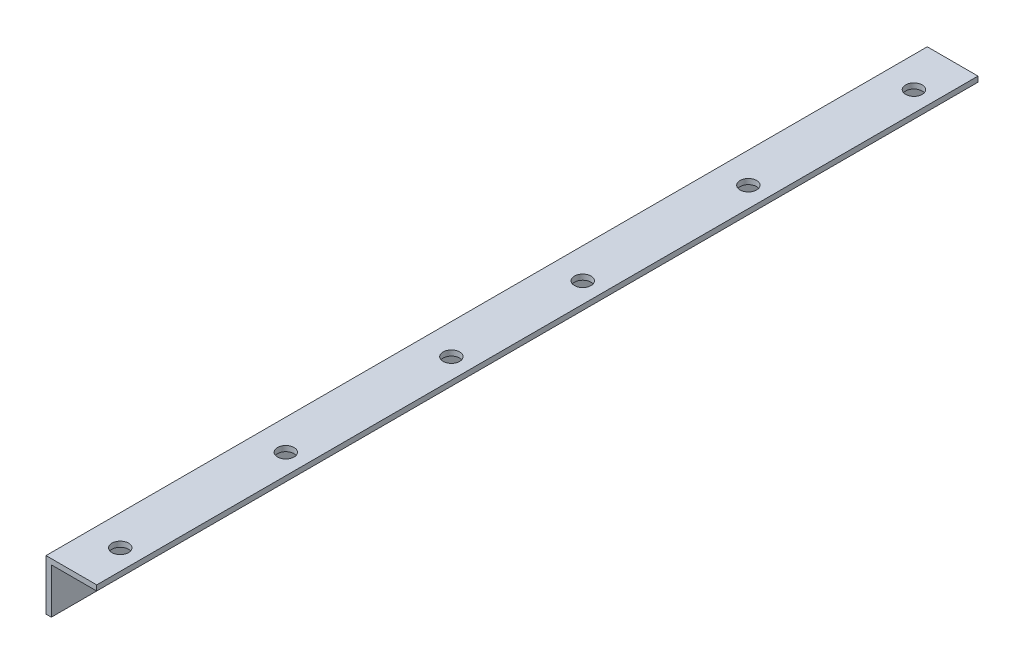
ISO-10303-21;
HEADER;
FILE_DESCRIPTION(('STEP AP214'),'2;1');
FILE_NAME('part.step','',(''),(''),'','','');
FILE_SCHEMA(('AUTOMOTIVE_DESIGN { 1 0 10303 214 1 1 1 1 }'));
ENDSEC;
DATA;
#1=APPLICATION_CONTEXT('core data for automotive mechanical design processes');
#2=APPLICATION_PROTOCOL_DEFINITION('international standard','automotive_design',2000,#1);
#3=PRODUCT_CONTEXT('',#1,'mechanical');
#4=PRODUCT('Part','Part','',(#3));
#5=PRODUCT_RELATED_PRODUCT_CATEGORY('part','',(#4));
#6=PRODUCT_DEFINITION_FORMATION('','',#4);
#7=PRODUCT_DEFINITION_CONTEXT('part definition',#1,'design');
#8=PRODUCT_DEFINITION('design','',#6,#7);
#9=PRODUCT_DEFINITION_SHAPE('','',#8);
#10=(LENGTH_UNIT() NAMED_UNIT(*) SI_UNIT(.MILLI.,.METRE.));
#11=(NAMED_UNIT(*) PLANE_ANGLE_UNIT() SI_UNIT($,.RADIAN.));
#12=(NAMED_UNIT(*) SI_UNIT($,.STERADIAN.) SOLID_ANGLE_UNIT());
#13=UNCERTAINTY_MEASURE_WITH_UNIT(LENGTH_MEASURE(1.E-05),#10,'distance_accuracy_value','');
#14=(GEOMETRIC_REPRESENTATION_CONTEXT(3) GLOBAL_UNCERTAINTY_ASSIGNED_CONTEXT((#13)) GLOBAL_UNIT_ASSIGNED_CONTEXT((#10,
#11,#12)) REPRESENTATION_CONTEXT('',''));
#15=CARTESIAN_POINT('',(0.,0.,0.));
#16=DIRECTION('',(0.,0.,1.));
#17=DIRECTION('',(1.,0.,0.));
#18=AXIS2_PLACEMENT_3D('',#15,#16,#17);
#19=CARTESIAN_POINT('',(-195.,0.,0.));
#20=DIRECTION('',(1.,0.,0.));
#21=DIRECTION('',(0.,0.,-1.));
#22=AXIS2_PLACEMENT_3D('',#19,#20,#21);
#23=PLANE('',#22);
#24=CARTESIAN_POINT('',(-195.,35.6,148.6));
#25=DIRECTION('',(1.,0.,0.));
#26=DIRECTION('',(0.,0.,-1.));
#27=AXIS2_PLACEMENT_3D('',#24,#25,#26);
#28=CIRCLE('',#27,3.175);
#29=CARTESIAN_POINT('',(-195.,35.6,145.425));
#30=VERTEX_POINT('',#29);
#31=EDGE_CURVE('E150',#30,#30,#28,.T.);
#32=ORIENTED_EDGE('',*,*,#31,.F.);
#33=EDGE_LOOP('',(#32));
#34=FACE_BOUND('',#33,.T.);
#35=CARTESIAN_POINT('',(-195.,35.6,24.6000000000001));
#36=DIRECTION('',(1.,0.,0.));
#37=DIRECTION('',(0.,0.,-1.));
#38=AXIS2_PLACEMENT_3D('',#35,#36,#37);
#39=CIRCLE('',#38,3.17499999999997);
#40=CARTESIAN_POINT('',(-195.,35.6,21.4250000000001));
#41=VERTEX_POINT('',#40);
#42=EDGE_CURVE('E138',#41,#41,#39,.T.);
#43=ORIENTED_EDGE('',*,*,#42,.F.);
#44=EDGE_LOOP('',(#43));
#45=FACE_BOUND('',#44,.T.);
#46=CARTESIAN_POINT('',(-195.,35.6,-148.6));
#47=DIRECTION('',(1.,0.,0.));
#48=DIRECTION('',(0.,0.,-1.));
#49=AXIS2_PLACEMENT_3D('',#46,#47,#48);
#50=CIRCLE('',#49,3.175);
#51=CARTESIAN_POINT('',(-195.,35.6,-151.775));
#52=VERTEX_POINT('',#51);
#53=EDGE_CURVE('E123',#52,#52,#50,.T.);
#54=ORIENTED_EDGE('',*,*,#53,.F.);
#55=EDGE_LOOP('',(#54));
#56=FACE_BOUND('',#55,.T.);
#57=CARTESIAN_POINT('',(-195.,35.6,-24.6));
#58=DIRECTION('',(1.,0.,0.));
#59=DIRECTION('',(0.,0.,-1.));
#60=AXIS2_PLACEMENT_3D('',#57,#58,#59);
#61=CIRCLE('',#60,3.17499999999996);
#62=CARTESIAN_POINT('',(-195.,35.6,-27.775));
#63=VERTEX_POINT('',#62);
#64=EDGE_CURVE('E132',#63,#63,#61,.T.);
#65=ORIENTED_EDGE('',*,*,#64,.F.);
#66=EDGE_LOOP('',(#65));
#67=FACE_BOUND('',#66,.T.);
#68=CARTESIAN_POINT('',(-195.,35.6,86.6000000000001));
#69=DIRECTION('',(1.,0.,0.));
#70=DIRECTION('',(0.,0.,-1.));
#71=AXIS2_PLACEMENT_3D('',#68,#69,#70);
#72=CIRCLE('',#71,3.17499999999997);
#73=CARTESIAN_POINT('',(-195.,35.6,83.4250000000001));
#74=VERTEX_POINT('',#73);
#75=EDGE_CURVE('E144',#74,#74,#72,.T.);
#76=ORIENTED_EDGE('',*,*,#75,.F.);
#77=EDGE_LOOP('',(#76));
#78=FACE_BOUND('',#77,.T.);
#79=CARTESIAN_POINT('',(-195.,35.6,-86.6));
#80=DIRECTION('',(1.,0.,0.));
#81=DIRECTION('',(0.,0.,-1.));
#82=AXIS2_PLACEMENT_3D('',#79,#80,#81);
#83=CIRCLE('',#82,3.17499999999997);
#84=CARTESIAN_POINT('',(-195.,35.6,-89.775));
#85=VERTEX_POINT('',#84);
#86=EDGE_CURVE('E156',#85,#85,#83,.T.);
#87=ORIENTED_EDGE('',*,*,#86,.F.);
#88=EDGE_LOOP('',(#87));
#89=FACE_BOUND('',#88,.T.);
#90=DIRECTION('',(0.,1.,0.));
#91=VECTOR('',#90,1.);
#92=CARTESIAN_POINT('',(-195.,50.,-165.));
#93=LINE('',#92,#91);
#94=CARTESIAN_POINT('',(-195.,28.,-165.));
#95=VERTEX_POINT('',#94);
#96=CARTESIAN_POINT('',(-195.,45.,-165.));
#97=VERTEX_POINT('',#96);
#98=EDGE_CURVE('E59',#95,#97,#93,.T.);
#99=ORIENTED_EDGE('',*,*,#98,.T.);
#100=DIRECTION('',(0.,0.,1.));
#101=VECTOR('',#100,1.);
#102=CARTESIAN_POINT('',(-195.,45.,0.));
#103=LINE('',#102,#101);
#104=CARTESIAN_POINT('',(-195.,45.,165.));
#105=VERTEX_POINT('',#104);
#106=EDGE_CURVE('E54',#97,#105,#103,.T.);
#107=ORIENTED_EDGE('',*,*,#106,.T.);
#108=DIRECTION('',(0.,-1.,0.));
#109=VECTOR('',#108,1.);
#110=CARTESIAN_POINT('',(-195.,50.,165.));
#111=LINE('',#110,#109);
#112=CARTESIAN_POINT('',(-195.,28.,165.));
#113=VERTEX_POINT('',#112);
#114=EDGE_CURVE('E114',#105,#113,#111,.T.);
#115=ORIENTED_EDGE('',*,*,#114,.T.);
#116=DIRECTION('',(0.,0.,-1.));
#117=VECTOR('',#116,1.);
#118=CARTESIAN_POINT('',(-195.,28.,165.));
#119=LINE('',#118,#117);
#120=EDGE_CURVE('E117',#113,#95,#119,.T.);
#121=ORIENTED_EDGE('',*,*,#120,.T.);
#122=EDGE_LOOP('',(#99,#107,#115,#121));
#123=FACE_BOUND('',#122,.T.);
#124=ADVANCED_FACE('F39',(#34,#45,#56,#67,#78,#89,#123),#23,.T.);
#125=CARTESIAN_POINT('',(-197.,0.,0.));
#126=DIRECTION('',(1.,0.,0.));
#127=DIRECTION('',(0.,0.,-1.));
#128=AXIS2_PLACEMENT_3D('',#125,#126,#127);
#129=PLANE('',#128);
#130=DIRECTION('',(0.,-1.,0.));
#131=VECTOR('',#130,1.);
#132=CARTESIAN_POINT('',(-197.,50.,165.));
#133=LINE('',#132,#131);
#134=CARTESIAN_POINT('',(-197.,46.9999999999994,165.));
#135=VERTEX_POINT('',#134);
#136=CARTESIAN_POINT('',(-197.,28.,165.));
#137=VERTEX_POINT('',#136);
#138=EDGE_CURVE('E108',#135,#137,#133,.T.);
#139=ORIENTED_EDGE('',*,*,#138,.F.);
#140=DIRECTION('',(0.,0.,-1.));
#141=VECTOR('',#140,1.);
#142=CARTESIAN_POINT('',(-197.,46.9999999999993,188.));
#143=LINE('',#142,#141);
#144=CARTESIAN_POINT('',(-197.,47.,-165.));
#145=VERTEX_POINT('',#144);
#146=EDGE_CURVE('E94',#135,#145,#143,.T.);
#147=ORIENTED_EDGE('',*,*,#146,.T.);
#148=DIRECTION('',(0.,1.,0.));
#149=VECTOR('',#148,1.);
#150=CARTESIAN_POINT('',(-197.,50.,-165.));
#151=LINE('',#150,#149);
#152=CARTESIAN_POINT('',(-197.,28.,-165.));
#153=VERTEX_POINT('',#152);
#154=EDGE_CURVE('E107',#153,#145,#151,.T.);
#155=ORIENTED_EDGE('',*,*,#154,.F.);
#156=DIRECTION('',(0.,0.,-1.));
#157=VECTOR('',#156,1.);
#158=CARTESIAN_POINT('',(-197.,28.,165.));
#159=LINE('',#158,#157);
#160=EDGE_CURVE('E115',#137,#153,#159,.T.);
#161=ORIENTED_EDGE('',*,*,#160,.F.);
#162=EDGE_LOOP('',(#139,#147,#155,#161));
#163=FACE_BOUND('',#162,.T.);
#164=CARTESIAN_POINT('',(-197.,35.6,-148.6));
#165=DIRECTION('',(1.,0.,0.));
#166=DIRECTION('',(0.,0.,-1.));
#167=AXIS2_PLACEMENT_3D('',#164,#165,#166);
#168=CIRCLE('',#167,3.175);
#169=CARTESIAN_POINT('',(-197.,35.6,-151.775));
#170=VERTEX_POINT('',#169);
#171=EDGE_CURVE('E127',#170,#170,#168,.T.);
#172=ORIENTED_EDGE('',*,*,#171,.T.);
#173=EDGE_LOOP('',(#172));
#174=FACE_BOUND('',#173,.T.);
#175=CARTESIAN_POINT('',(-197.,35.6,-24.6));
#176=DIRECTION('',(1.,0.,0.));
#177=DIRECTION('',(0.,0.,-1.));
#178=AXIS2_PLACEMENT_3D('',#175,#176,#177);
#179=CIRCLE('',#178,3.17499999999996);
#180=CARTESIAN_POINT('',(-197.,35.6,-27.775));
#181=VERTEX_POINT('',#180);
#182=EDGE_CURVE('E135',#181,#181,#179,.T.);
#183=ORIENTED_EDGE('',*,*,#182,.T.);
#184=EDGE_LOOP('',(#183));
#185=FACE_BOUND('',#184,.T.);
#186=CARTESIAN_POINT('',(-197.,35.6,24.6000000000001));
#187=DIRECTION('',(1.,0.,0.));
#188=DIRECTION('',(0.,0.,-1.));
#189=AXIS2_PLACEMENT_3D('',#186,#187,#188);
#190=CIRCLE('',#189,3.17499999999997);
#191=CARTESIAN_POINT('',(-197.,35.6,21.4250000000001));
#192=VERTEX_POINT('',#191);
#193=EDGE_CURVE('E141',#192,#192,#190,.T.);
#194=ORIENTED_EDGE('',*,*,#193,.T.);
#195=EDGE_LOOP('',(#194));
#196=FACE_BOUND('',#195,.T.);
#197=CARTESIAN_POINT('',(-197.,35.6,86.6000000000001));
#198=DIRECTION('',(1.,0.,0.));
#199=DIRECTION('',(0.,0.,-1.));
#200=AXIS2_PLACEMENT_3D('',#197,#198,#199);
#201=CIRCLE('',#200,3.17499999999997);
#202=CARTESIAN_POINT('',(-197.,35.6,83.4250000000001));
#203=VERTEX_POINT('',#202);
#204=EDGE_CURVE('E147',#203,#203,#201,.T.);
#205=ORIENTED_EDGE('',*,*,#204,.T.);
#206=EDGE_LOOP('',(#205));
#207=FACE_BOUND('',#206,.T.);
#208=CARTESIAN_POINT('',(-197.,35.6,148.6));
#209=DIRECTION('',(1.,0.,0.));
#210=DIRECTION('',(0.,0.,-1.));
#211=AXIS2_PLACEMENT_3D('',#208,#209,#210);
#212=CIRCLE('',#211,3.175);
#213=CARTESIAN_POINT('',(-197.,35.6,145.425));
#214=VERTEX_POINT('',#213);
#215=EDGE_CURVE('E153',#214,#214,#212,.T.);
#216=ORIENTED_EDGE('',*,*,#215,.T.);
#217=EDGE_LOOP('',(#216));
#218=FACE_BOUND('',#217,.T.);
#219=CARTESIAN_POINT('',(-197.,35.6,-86.6));
#220=DIRECTION('',(1.,0.,0.));
#221=DIRECTION('',(0.,0.,-1.));
#222=AXIS2_PLACEMENT_3D('',#219,#220,#221);
#223=CIRCLE('',#222,3.17499999999997);
#224=CARTESIAN_POINT('',(-197.,35.6,-89.775));
#225=VERTEX_POINT('',#224);
#226=EDGE_CURVE('E159',#225,#225,#223,.T.);
#227=ORIENTED_EDGE('',*,*,#226,.T.);
#228=EDGE_LOOP('',(#227));
#229=FACE_BOUND('',#228,.T.);
#230=ADVANCED_FACE('F104',(#163,#174,#185,#196,#207,#218,#229),#129,.F.);
#231=CARTESIAN_POINT('',(-195.,50.,165.));
#232=DIRECTION('',(0.,0.,-1.));
#233=DIRECTION('',(-1.,0.,0.));
#234=AXIS2_PLACEMENT_3D('',#231,#232,#233);
#235=PLANE('',#234);
#236=DIRECTION('',(1.,0.,0.));
#237=VECTOR('',#236,1.);
#238=CARTESIAN_POINT('',(-200.,47.,165.));
#239=LINE('',#238,#237);
#240=CARTESIAN_POINT('',(-178.,47.,165.));
#241=VERTEX_POINT('',#240);
#242=EDGE_CURVE('E172',#135,#241,#239,.T.);
#243=ORIENTED_EDGE('',*,*,#242,.F.);
#244=ORIENTED_EDGE('',*,*,#138,.T.);
#245=DIRECTION('',(-1.,0.,0.));
#246=VECTOR('',#245,1.);
#247=CARTESIAN_POINT('',(-195.,28.,165.));
#248=LINE('',#247,#246);
#249=EDGE_CURVE('E11',#113,#137,#248,.T.);
#250=ORIENTED_EDGE('',*,*,#249,.F.);
#251=ORIENTED_EDGE('',*,*,#114,.F.);
#252=DIRECTION('',(1.,0.,0.));
#253=VECTOR('',#252,1.);
#254=CARTESIAN_POINT('',(-200.,45.,165.));
#255=LINE('',#254,#253);
#256=CARTESIAN_POINT('',(-178.,45.,165.));
#257=VERTEX_POINT('',#256);
#258=EDGE_CURVE('E100',#105,#257,#255,.T.);
#259=ORIENTED_EDGE('',*,*,#258,.T.);
#260=DIRECTION('',(0.,1.,0.));
#261=VECTOR('',#260,1.);
#262=CARTESIAN_POINT('',(-178.,45.,165.));
#263=LINE('',#262,#261);
#264=EDGE_CURVE('E166',#257,#241,#263,.T.);
#265=ORIENTED_EDGE('',*,*,#264,.T.);
#266=EDGE_LOOP('',(#243,#244,#250,#251,#259,#265));
#267=FACE_BOUND('',#266,.T.);
#268=ADVANCED_FACE('F41',(#267),#235,.F.);
#269=CARTESIAN_POINT('',(-195.,28.,165.));
#270=DIRECTION('',(0.,1.,0.));
#271=DIRECTION('',(0.,0.,1.));
#272=AXIS2_PLACEMENT_3D('',#269,#270,#271);
#273=PLANE('',#272);
#274=ORIENTED_EDGE('',*,*,#160,.T.);
#275=DIRECTION('',(-1.,0.,0.));
#276=VECTOR('',#275,1.);
#277=CARTESIAN_POINT('',(-195.,28.,-165.));
#278=LINE('',#277,#276);
#279=EDGE_CURVE('E47',#95,#153,#278,.T.);
#280=ORIENTED_EDGE('',*,*,#279,.F.);
#281=ORIENTED_EDGE('',*,*,#120,.F.);
#282=ORIENTED_EDGE('',*,*,#249,.T.);
#283=EDGE_LOOP('',(#274,#280,#281,#282));
#284=FACE_BOUND('',#283,.T.);
#285=ADVANCED_FACE('F269',(#284),#273,.F.);
#286=CARTESIAN_POINT('',(-195.,50.,-165.));
#287=DIRECTION('',(0.,0.,1.));
#288=DIRECTION('',(1.,0.,0.));
#289=AXIS2_PLACEMENT_3D('',#286,#287,#288);
#290=PLANE('',#289);
#291=ORIENTED_EDGE('',*,*,#154,.T.);
#292=DIRECTION('',(-1.,0.,0.));
#293=VECTOR('',#292,1.);
#294=CARTESIAN_POINT('',(-200.,47.,-165.));
#295=LINE('',#294,#293);
#296=CARTESIAN_POINT('',(-178.,47.,-165.));
#297=VERTEX_POINT('',#296);
#298=EDGE_CURVE('E91',#297,#145,#295,.T.);
#299=ORIENTED_EDGE('',*,*,#298,.F.);
#300=DIRECTION('',(0.,1.,0.));
#301=VECTOR('',#300,1.);
#302=CARTESIAN_POINT('',(-178.,45.,-165.));
#303=LINE('',#302,#301);
#304=CARTESIAN_POINT('',(-178.,45.,-165.));
#305=VERTEX_POINT('',#304);
#306=EDGE_CURVE('E165',#305,#297,#303,.T.);
#307=ORIENTED_EDGE('',*,*,#306,.F.);
#308=DIRECTION('',(-1.,0.,0.));
#309=VECTOR('',#308,1.);
#310=CARTESIAN_POINT('',(-200.,45.,-165.));
#311=LINE('',#310,#309);
#312=EDGE_CURVE('E169',#305,#97,#311,.T.);
#313=ORIENTED_EDGE('',*,*,#312,.T.);
#314=ORIENTED_EDGE('',*,*,#98,.F.);
#315=ORIENTED_EDGE('',*,*,#279,.T.);
#316=EDGE_LOOP('',(#291,#299,#307,#313,#314,#315));
#317=FACE_BOUND('',#316,.T.);
#318=ADVANCED_FACE('F112',(#317),#290,.F.);
#319=CARTESIAN_POINT('',(-195.,35.6,-148.6));
#320=DIRECTION('',(-1.,0.,0.));
#321=DIRECTION('',(0.,0.,1.));
#322=AXIS2_PLACEMENT_3D('',#319,#320,#321);
#323=CYLINDRICAL_SURFACE('',#322,3.175);
#324=ORIENTED_EDGE('',*,*,#53,.T.);
#325=EDGE_LOOP('',(#324));
#326=FACE_BOUND('',#325,.T.);
#327=ORIENTED_EDGE('',*,*,#171,.F.);
#328=EDGE_LOOP('',(#327));
#329=FACE_BOUND('',#328,.T.);
#330=ADVANCED_FACE('F265',(#326,#329),#323,.F.);
#331=CARTESIAN_POINT('',(-195.,35.6,-24.6));
#332=DIRECTION('',(-1.,0.,0.));
#333=DIRECTION('',(0.,0.,1.));
#334=AXIS2_PLACEMENT_3D('',#331,#332,#333);
#335=CYLINDRICAL_SURFACE('',#334,3.17499999999996);
#336=ORIENTED_EDGE('',*,*,#64,.T.);
#337=EDGE_LOOP('',(#336));
#338=FACE_BOUND('',#337,.T.);
#339=ORIENTED_EDGE('',*,*,#182,.F.);
#340=EDGE_LOOP('',(#339));
#341=FACE_BOUND('',#340,.T.);
#342=ADVANCED_FACE('F301',(#338,#341),#335,.F.);
#343=CARTESIAN_POINT('',(-195.,35.6,24.6000000000001));
#344=DIRECTION('',(-1.,0.,0.));
#345=DIRECTION('',(0.,0.,1.));
#346=AXIS2_PLACEMENT_3D('',#343,#344,#345);
#347=CYLINDRICAL_SURFACE('',#346,3.17499999999997);
#348=ORIENTED_EDGE('',*,*,#42,.T.);
#349=EDGE_LOOP('',(#348));
#350=FACE_BOUND('',#349,.T.);
#351=ORIENTED_EDGE('',*,*,#193,.F.);
#352=EDGE_LOOP('',(#351));
#353=FACE_BOUND('',#352,.T.);
#354=ADVANCED_FACE('F298',(#350,#353),#347,.F.);
#355=CARTESIAN_POINT('',(-195.,35.6,86.6000000000001));
#356=DIRECTION('',(-1.,0.,0.));
#357=DIRECTION('',(0.,0.,1.));
#358=AXIS2_PLACEMENT_3D('',#355,#356,#357);
#359=CYLINDRICAL_SURFACE('',#358,3.17499999999997);
#360=ORIENTED_EDGE('',*,*,#75,.T.);
#361=EDGE_LOOP('',(#360));
#362=FACE_BOUND('',#361,.T.);
#363=ORIENTED_EDGE('',*,*,#204,.F.);
#364=EDGE_LOOP('',(#363));
#365=FACE_BOUND('',#364,.T.);
#366=ADVANCED_FACE('F294',(#362,#365),#359,.F.);
#367=CARTESIAN_POINT('',(-195.,35.6,148.6));
#368=DIRECTION('',(-1.,0.,0.));
#369=DIRECTION('',(0.,0.,1.));
#370=AXIS2_PLACEMENT_3D('',#367,#368,#369);
#371=CYLINDRICAL_SURFACE('',#370,3.175);
#372=ORIENTED_EDGE('',*,*,#31,.T.);
#373=EDGE_LOOP('',(#372));
#374=FACE_BOUND('',#373,.T.);
#375=ORIENTED_EDGE('',*,*,#215,.F.);
#376=EDGE_LOOP('',(#375));
#377=FACE_BOUND('',#376,.T.);
#378=ADVANCED_FACE('F288',(#374,#377),#371,.F.);
#379=CARTESIAN_POINT('',(-195.,35.6,-86.6));
#380=DIRECTION('',(-1.,0.,0.));
#381=DIRECTION('',(0.,0.,1.));
#382=AXIS2_PLACEMENT_3D('',#379,#380,#381);
#383=CYLINDRICAL_SURFACE('',#382,3.17499999999997);
#384=ORIENTED_EDGE('',*,*,#86,.T.);
#385=EDGE_LOOP('',(#384));
#386=FACE_BOUND('',#385,.T.);
#387=ORIENTED_EDGE('',*,*,#226,.F.);
#388=EDGE_LOOP('',(#387));
#389=FACE_BOUND('',#388,.T.);
#390=ADVANCED_FACE('F284',(#386,#389),#383,.F.);
#391=CARTESIAN_POINT('',(-178.,45.,-165.));
#392=DIRECTION('',(1.,0.,0.));
#393=DIRECTION('',(0.,0.,-1.));
#394=AXIS2_PLACEMENT_3D('',#391,#392,#393);
#395=PLANE('',#394);
#396=DIRECTION('',(0.,0.,-1.));
#397=VECTOR('',#396,1.);
#398=CARTESIAN_POINT('',(-178.,47.,-165.));
#399=LINE('',#398,#397);
#400=EDGE_CURVE('E97',#241,#297,#399,.T.);
#401=ORIENTED_EDGE('',*,*,#400,.F.);
#402=ORIENTED_EDGE('',*,*,#264,.F.);
#403=DIRECTION('',(0.,0.,-1.));
#404=VECTOR('',#403,1.);
#405=CARTESIAN_POINT('',(-178.,45.,-165.));
#406=LINE('',#405,#404);
#407=EDGE_CURVE('E177',#257,#305,#406,.T.);
#408=ORIENTED_EDGE('',*,*,#407,.T.);
#409=ORIENTED_EDGE('',*,*,#306,.T.);
#410=EDGE_LOOP('',(#401,#402,#408,#409));
#411=FACE_BOUND('',#410,.T.);
#412=ADVANCED_FACE('F283',(#411),#395,.T.);
#413=CARTESIAN_POINT('',(0.,45.,0.));
#414=DIRECTION('',(0.,1.,0.));
#415=DIRECTION('',(0.,0.,1.));
#416=AXIS2_PLACEMENT_3D('',#413,#414,#415);
#417=PLANE('',#416);
#418=ORIENTED_EDGE('',*,*,#106,.F.);
#419=ORIENTED_EDGE('',*,*,#312,.F.);
#420=ORIENTED_EDGE('',*,*,#407,.F.);
#421=ORIENTED_EDGE('',*,*,#258,.F.);
#422=EDGE_LOOP('',(#418,#419,#420,#421));
#423=FACE_BOUND('',#422,.T.);
#424=CARTESIAN_POINT('',(-185.599999999998,45.,24.6));
#425=DIRECTION('',(0.,1.,0.));
#426=DIRECTION('',(0.,0.,1.));
#427=AXIS2_PLACEMENT_3D('',#424,#425,#426);
#428=CIRCLE('',#427,3.09999999999983);
#429=CARTESIAN_POINT('',(-185.599999999998,45.,27.6999999999998));
#430=VERTEX_POINT('',#429);
#431=EDGE_CURVE('E208',#430,#430,#428,.T.);
#432=ORIENTED_EDGE('',*,*,#431,.T.);
#433=EDGE_LOOP('',(#432));
#434=FACE_BOUND('',#433,.T.);
#435=CARTESIAN_POINT('',(-185.599999999999,45.,86.6));
#436=DIRECTION('',(0.,1.,0.));
#437=DIRECTION('',(0.,0.,1.));
#438=AXIS2_PLACEMENT_3D('',#435,#436,#437);
#439=CIRCLE('',#438,3.09999999999982);
#440=CARTESIAN_POINT('',(-185.599999999999,45.,89.6999999999998));
#441=VERTEX_POINT('',#440);
#442=EDGE_CURVE('E202',#441,#441,#439,.T.);
#443=ORIENTED_EDGE('',*,*,#442,.T.);
#444=EDGE_LOOP('',(#443));
#445=FACE_BOUND('',#444,.T.);
#446=CARTESIAN_POINT('',(-185.599999999999,45.,148.6));
#447=DIRECTION('',(0.,1.,0.));
#448=DIRECTION('',(0.,0.,1.));
#449=AXIS2_PLACEMENT_3D('',#446,#447,#448);
#450=CIRCLE('',#449,3.09999999999982);
#451=CARTESIAN_POINT('',(-185.599999999999,45.,151.7));
#452=VERTEX_POINT('',#451);
#453=EDGE_CURVE('E196',#452,#452,#450,.T.);
#454=ORIENTED_EDGE('',*,*,#453,.T.);
#455=EDGE_LOOP('',(#454));
#456=FACE_BOUND('',#455,.T.);
#457=CARTESIAN_POINT('',(-185.599999999998,45.,-24.6));
#458=DIRECTION('',(0.,1.,0.));
#459=DIRECTION('',(0.,0.,1.));
#460=AXIS2_PLACEMENT_3D('',#457,#458,#459);
#461=CIRCLE('',#460,3.09999999999978);
#462=CARTESIAN_POINT('',(-185.599999999998,45.,-21.5000000000002));
#463=VERTEX_POINT('',#462);
#464=EDGE_CURVE('E190',#463,#463,#461,.T.);
#465=ORIENTED_EDGE('',*,*,#464,.T.);
#466=EDGE_LOOP('',(#465));
#467=FACE_BOUND('',#466,.T.);
#468=CARTESIAN_POINT('',(-185.599999999999,45.,-86.6));
#469=DIRECTION('',(0.,1.,0.));
#470=DIRECTION('',(0.,0.,1.));
#471=AXIS2_PLACEMENT_3D('',#468,#469,#470);
#472=CIRCLE('',#471,3.09999999999978);
#473=CARTESIAN_POINT('',(-185.599999999999,45.,-83.5000000000002));
#474=VERTEX_POINT('',#473);
#475=EDGE_CURVE('E184',#474,#474,#472,.T.);
#476=ORIENTED_EDGE('',*,*,#475,.T.);
#477=EDGE_LOOP('',(#476));
#478=FACE_BOUND('',#477,.T.);
#479=CARTESIAN_POINT('',(-185.599999999999,45.,-148.6));
#480=DIRECTION('',(0.,1.,0.));
#481=DIRECTION('',(0.,0.,1.));
#482=AXIS2_PLACEMENT_3D('',#479,#480,#481);
#483=CIRCLE('',#482,3.09999999999978);
#484=CARTESIAN_POINT('',(-185.599999999999,45.,-145.5));
#485=VERTEX_POINT('',#484);
#486=EDGE_CURVE('E174',#485,#485,#483,.T.);
#487=ORIENTED_EDGE('',*,*,#486,.T.);
#488=EDGE_LOOP('',(#487));
#489=FACE_BOUND('',#488,.T.);
#490=ADVANCED_FACE('F216',(#423,#434,#445,#456,#467,#478,#489),#417,.F.);
#491=CARTESIAN_POINT('',(0.,47.,0.));
#492=DIRECTION('',(0.,1.,0.));
#493=DIRECTION('',(0.,0.,1.));
#494=AXIS2_PLACEMENT_3D('',#491,#492,#493);
#495=PLANE('',#494);
#496=CARTESIAN_POINT('',(-185.599999999998,47.,24.6));
#497=DIRECTION('',(0.,1.,0.));
#498=DIRECTION('',(0.,0.,1.));
#499=AXIS2_PLACEMENT_3D('',#496,#497,#498);
#500=CIRCLE('',#499,3.09999999999983);
#501=CARTESIAN_POINT('',(-185.599999999998,47.,27.6999999999998));
#502=VERTEX_POINT('',#501);
#503=EDGE_CURVE('E109',#502,#502,#500,.T.);
#504=ORIENTED_EDGE('',*,*,#503,.F.);
#505=EDGE_LOOP('',(#504));
#506=FACE_BOUND('',#505,.T.);
#507=CARTESIAN_POINT('',(-185.599999999999,47.,86.6));
#508=DIRECTION('',(0.,1.,0.));
#509=DIRECTION('',(0.,0.,1.));
#510=AXIS2_PLACEMENT_3D('',#507,#508,#509);
#511=CIRCLE('',#510,3.09999999999982);
#512=CARTESIAN_POINT('',(-185.599999999999,47.,89.6999999999998));
#513=VERTEX_POINT('',#512);
#514=EDGE_CURVE('E205',#513,#513,#511,.T.);
#515=ORIENTED_EDGE('',*,*,#514,.F.);
#516=EDGE_LOOP('',(#515));
#517=FACE_BOUND('',#516,.T.);
#518=CARTESIAN_POINT('',(-185.599999999999,47.,148.6));
#519=DIRECTION('',(0.,1.,0.));
#520=DIRECTION('',(0.,0.,1.));
#521=AXIS2_PLACEMENT_3D('',#518,#519,#520);
#522=CIRCLE('',#521,3.09999999999982);
#523=CARTESIAN_POINT('',(-185.599999999999,47.,151.7));
#524=VERTEX_POINT('',#523);
#525=EDGE_CURVE('E199',#524,#524,#522,.T.);
#526=ORIENTED_EDGE('',*,*,#525,.F.);
#527=EDGE_LOOP('',(#526));
#528=FACE_BOUND('',#527,.T.);
#529=CARTESIAN_POINT('',(-185.599999999998,47.,-24.6));
#530=DIRECTION('',(0.,1.,0.));
#531=DIRECTION('',(0.,0.,1.));
#532=AXIS2_PLACEMENT_3D('',#529,#530,#531);
#533=CIRCLE('',#532,3.09999999999978);
#534=CARTESIAN_POINT('',(-185.599999999998,47.,-21.5000000000002));
#535=VERTEX_POINT('',#534);
#536=EDGE_CURVE('E193',#535,#535,#533,.T.);
#537=ORIENTED_EDGE('',*,*,#536,.F.);
#538=EDGE_LOOP('',(#537));
#539=FACE_BOUND('',#538,.T.);
#540=CARTESIAN_POINT('',(-185.599999999999,47.,-86.6));
#541=DIRECTION('',(0.,1.,0.));
#542=DIRECTION('',(0.,0.,1.));
#543=AXIS2_PLACEMENT_3D('',#540,#541,#542);
#544=CIRCLE('',#543,3.09999999999978);
#545=CARTESIAN_POINT('',(-185.599999999999,47.,-83.5000000000002));
#546=VERTEX_POINT('',#545);
#547=EDGE_CURVE('E187',#546,#546,#544,.T.);
#548=ORIENTED_EDGE('',*,*,#547,.F.);
#549=EDGE_LOOP('',(#548));
#550=FACE_BOUND('',#549,.T.);
#551=CARTESIAN_POINT('',(-185.599999999999,47.,-148.6));
#552=DIRECTION('',(0.,1.,0.));
#553=DIRECTION('',(0.,0.,1.));
#554=AXIS2_PLACEMENT_3D('',#551,#552,#553);
#555=CIRCLE('',#554,3.09999999999978);
#556=CARTESIAN_POINT('',(-185.599999999999,47.,-145.5));
#557=VERTEX_POINT('',#556);
#558=EDGE_CURVE('E181',#557,#557,#555,.T.);
#559=ORIENTED_EDGE('',*,*,#558,.F.);
#560=EDGE_LOOP('',(#559));
#561=FACE_BOUND('',#560,.T.);
#562=ORIENTED_EDGE('',*,*,#298,.T.);
#563=ORIENTED_EDGE('',*,*,#146,.F.);
#564=ORIENTED_EDGE('',*,*,#242,.T.);
#565=ORIENTED_EDGE('',*,*,#400,.T.);
#566=EDGE_LOOP('',(#562,#563,#564,#565));
#567=FACE_BOUND('',#566,.T.);
#568=ADVANCED_FACE('F93',(#506,#517,#528,#539,#550,#561,#567),#495,.T.);
#569=CARTESIAN_POINT('',(-185.599999999999,45.,-148.6));
#570=DIRECTION('',(0.,1.,0.));
#571=DIRECTION('',(0.,0.,1.));
#572=AXIS2_PLACEMENT_3D('',#569,#570,#571);
#573=CYLINDRICAL_SURFACE('',#572,3.09999999999978);
#574=ORIENTED_EDGE('',*,*,#486,.F.);
#575=EDGE_LOOP('',(#574));
#576=FACE_BOUND('',#575,.T.);
#577=ORIENTED_EDGE('',*,*,#558,.T.);
#578=EDGE_LOOP('',(#577));
#579=FACE_BOUND('',#578,.T.);
#580=ADVANCED_FACE('F228',(#576,#579),#573,.F.);
#581=CARTESIAN_POINT('',(-185.599999999999,45.,-86.6));
#582=DIRECTION('',(0.,1.,0.));
#583=DIRECTION('',(0.,0.,1.));
#584=AXIS2_PLACEMENT_3D('',#581,#582,#583);
#585=CYLINDRICAL_SURFACE('',#584,3.09999999999978);
#586=ORIENTED_EDGE('',*,*,#475,.F.);
#587=EDGE_LOOP('',(#586));
#588=FACE_BOUND('',#587,.T.);
#589=ORIENTED_EDGE('',*,*,#547,.T.);
#590=EDGE_LOOP('',(#589));
#591=FACE_BOUND('',#590,.T.);
#592=ADVANCED_FACE('F241',(#588,#591),#585,.F.);
#593=CARTESIAN_POINT('',(-185.599999999998,45.,-24.6));
#594=DIRECTION('',(0.,1.,0.));
#595=DIRECTION('',(0.,0.,1.));
#596=AXIS2_PLACEMENT_3D('',#593,#594,#595);
#597=CYLINDRICAL_SURFACE('',#596,3.09999999999978);
#598=ORIENTED_EDGE('',*,*,#464,.F.);
#599=EDGE_LOOP('',(#598));
#600=FACE_BOUND('',#599,.T.);
#601=ORIENTED_EDGE('',*,*,#536,.T.);
#602=EDGE_LOOP('',(#601));
#603=FACE_BOUND('',#602,.T.);
#604=ADVANCED_FACE('F248',(#600,#603),#597,.F.);
#605=CARTESIAN_POINT('',(-185.599999999999,45.,148.6));
#606=DIRECTION('',(0.,1.,0.));
#607=DIRECTION('',(0.,0.,1.));
#608=AXIS2_PLACEMENT_3D('',#605,#606,#607);
#609=CYLINDRICAL_SURFACE('',#608,3.09999999999982);
#610=ORIENTED_EDGE('',*,*,#453,.F.);
#611=EDGE_LOOP('',(#610));
#612=FACE_BOUND('',#611,.T.);
#613=ORIENTED_EDGE('',*,*,#525,.T.);
#614=EDGE_LOOP('',(#613));
#615=FACE_BOUND('',#614,.T.);
#616=ADVANCED_FACE('F420',(#612,#615),#609,.F.);
#617=CARTESIAN_POINT('',(-185.599999999999,45.,86.6));
#618=DIRECTION('',(0.,1.,0.));
#619=DIRECTION('',(0.,0.,1.));
#620=AXIS2_PLACEMENT_3D('',#617,#618,#619);
#621=CYLINDRICAL_SURFACE('',#620,3.09999999999982);
#622=ORIENTED_EDGE('',*,*,#442,.F.);
#623=EDGE_LOOP('',(#622));
#624=FACE_BOUND('',#623,.T.);
#625=ORIENTED_EDGE('',*,*,#514,.T.);
#626=EDGE_LOOP('',(#625));
#627=FACE_BOUND('',#626,.T.);
#628=ADVANCED_FACE('F222',(#624,#627),#621,.F.);
#629=CARTESIAN_POINT('',(-185.599999999998,45.,24.6));
#630=DIRECTION('',(0.,1.,0.));
#631=DIRECTION('',(0.,0.,1.));
#632=AXIS2_PLACEMENT_3D('',#629,#630,#631);
#633=CYLINDRICAL_SURFACE('',#632,3.09999999999983);
#634=ORIENTED_EDGE('',*,*,#431,.F.);
#635=EDGE_LOOP('',(#634));
#636=FACE_BOUND('',#635,.T.);
#637=ORIENTED_EDGE('',*,*,#503,.T.);
#638=EDGE_LOOP('',(#637));
#639=FACE_BOUND('',#638,.T.);
#640=ADVANCED_FACE('F219',(#636,#639),#633,.F.);
#641=CLOSED_SHELL('',(#124,#230,#268,#285,#318,#330,#342,#354,#366,#378,#390,#412,#490,#568,
#580,#592,#604,#616,#628,#640));
#642=MANIFOLD_SOLID_BREP('B2',#641);
#643=ADVANCED_BREP_SHAPE_REPRESENTATION('',(#18,#642),#14);
#644=SHAPE_DEFINITION_REPRESENTATION(#9,#643);
ENDSEC;
END-ISO-10303-21;
